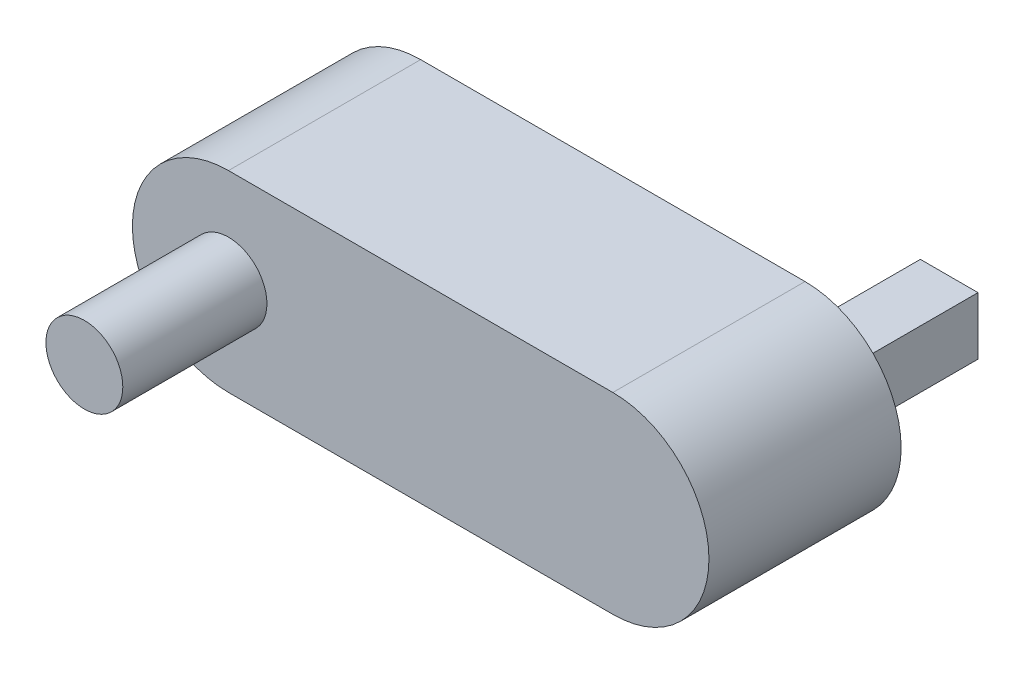
ISO-10303-21;
HEADER;
FILE_DESCRIPTION(('STEP AP214'),'2;1');
FILE_NAME('part.step','',(''),(''),'','','');
FILE_SCHEMA(('AUTOMOTIVE_DESIGN { 1 0 10303 214 1 1 1 1 }'));
ENDSEC;
DATA;
#1=APPLICATION_CONTEXT('core data for automotive mechanical design processes');
#2=APPLICATION_PROTOCOL_DEFINITION('international standard','automotive_design',2000,#1);
#3=PRODUCT_CONTEXT('',#1,'mechanical');
#4=PRODUCT('Part','Part','',(#3));
#5=PRODUCT_RELATED_PRODUCT_CATEGORY('part','',(#4));
#6=PRODUCT_DEFINITION_FORMATION('','',#4);
#7=PRODUCT_DEFINITION_CONTEXT('part definition',#1,'design');
#8=PRODUCT_DEFINITION('design','',#6,#7);
#9=PRODUCT_DEFINITION_SHAPE('','',#8);
#10=(LENGTH_UNIT() NAMED_UNIT(*) SI_UNIT(.MILLI.,.METRE.));
#11=(NAMED_UNIT(*) PLANE_ANGLE_UNIT() SI_UNIT($,.RADIAN.));
#12=(NAMED_UNIT(*) SI_UNIT($,.STERADIAN.) SOLID_ANGLE_UNIT());
#13=UNCERTAINTY_MEASURE_WITH_UNIT(LENGTH_MEASURE(1.E-05),#10,'distance_accuracy_value','');
#14=(GEOMETRIC_REPRESENTATION_CONTEXT(3) GLOBAL_UNCERTAINTY_ASSIGNED_CONTEXT((#13)) GLOBAL_UNIT_ASSIGNED_CONTEXT((#10,
#11,#12)) REPRESENTATION_CONTEXT('',''));
#15=CARTESIAN_POINT('',(0.,0.,0.));
#16=DIRECTION('',(0.,0.,1.));
#17=DIRECTION('',(1.,0.,0.));
#18=AXIS2_PLACEMENT_3D('',#15,#16,#17);
#19=CARTESIAN_POINT('',(0.,0.,-10.));
#20=DIRECTION('',(0.,0.,1.));
#21=DIRECTION('',(1.,0.,0.));
#22=AXIS2_PLACEMENT_3D('',#19,#20,#21);
#23=PLANE('',#22);
#24=CARTESIAN_POINT('',(0.,0.,-10.));
#25=DIRECTION('',(0.,0.,1.));
#26=DIRECTION('',(1.,0.,0.));
#27=AXIS2_PLACEMENT_3D('',#24,#25,#26);
#28=CIRCLE('',#27,10.);
#29=CARTESIAN_POINT('',(0.,10.,-10.));
#30=VERTEX_POINT('',#29);
#31=CARTESIAN_POINT('',(0.,-10.,-10.));
#32=VERTEX_POINT('',#31);
#33=EDGE_CURVE('E137',#30,#32,#28,.T.);
#34=ORIENTED_EDGE('',*,*,#33,.F.);
#35=DIRECTION('',(-1.,0.,0.));
#36=VECTOR('',#35,1.);
#37=CARTESIAN_POINT('',(0.,10.,-10.));
#38=LINE('',#37,#36);
#39=CARTESIAN_POINT('',(40.,10.,-10.));
#40=VERTEX_POINT('',#39);
#41=EDGE_CURVE('E143',#40,#30,#38,.T.);
#42=ORIENTED_EDGE('',*,*,#41,.F.);
#43=CARTESIAN_POINT('',(40.,0.,-10.));
#44=DIRECTION('',(0.,0.,1.));
#45=DIRECTION('',(1.,0.,0.));
#46=AXIS2_PLACEMENT_3D('',#43,#44,#45);
#47=CIRCLE('',#46,10.);
#48=CARTESIAN_POINT('',(40.,-10.,-10.));
#49=VERTEX_POINT('',#48);
#50=EDGE_CURVE('E154',#49,#40,#47,.T.);
#51=ORIENTED_EDGE('',*,*,#50,.F.);
#52=DIRECTION('',(1.,0.,0.));
#53=VECTOR('',#52,1.);
#54=CARTESIAN_POINT('',(0.,-10.,-10.));
#55=LINE('',#54,#53);
#56=EDGE_CURVE('E152',#32,#49,#55,.T.);
#57=ORIENTED_EDGE('',*,*,#56,.F.);
#58=EDGE_LOOP('',(#34,#42,#51,#57));
#59=FACE_BOUND('',#58,.T.);
#60=DIRECTION('',(0.,1.,0.));
#61=VECTOR('',#60,1.);
#62=CARTESIAN_POINT('',(37.,-3.,-10.));
#63=LINE('',#62,#61);
#64=CARTESIAN_POINT('',(37.,-3.,-10.));
#65=VERTEX_POINT('',#64);
#66=CARTESIAN_POINT('',(37.,3.,-10.));
#67=VERTEX_POINT('',#66);
#68=EDGE_CURVE('E126',#65,#67,#63,.T.);
#69=ORIENTED_EDGE('',*,*,#68,.F.);
#70=DIRECTION('',(-1.,0.,0.));
#71=VECTOR('',#70,1.);
#72=CARTESIAN_POINT('',(43.,-3.,-10.));
#73=LINE('',#72,#71);
#74=CARTESIAN_POINT('',(43.,-3.,-10.));
#75=VERTEX_POINT('',#74);
#76=EDGE_CURVE('E123',#75,#65,#73,.T.);
#77=ORIENTED_EDGE('',*,*,#76,.F.);
#78=DIRECTION('',(0.,-1.,0.));
#79=VECTOR('',#78,1.);
#80=CARTESIAN_POINT('',(43.,-3.,-10.));
#81=LINE('',#80,#79);
#82=CARTESIAN_POINT('',(43.,3.,-10.));
#83=VERTEX_POINT('',#82);
#84=EDGE_CURVE('E61',#83,#75,#81,.T.);
#85=ORIENTED_EDGE('',*,*,#84,.F.);
#86=DIRECTION('',(1.,0.,0.));
#87=VECTOR('',#86,1.);
#88=CARTESIAN_POINT('',(43.,3.,-10.));
#89=LINE('',#88,#87);
#90=EDGE_CURVE('E56',#67,#83,#89,.T.);
#91=ORIENTED_EDGE('',*,*,#90,.F.);
#92=EDGE_LOOP('',(#69,#77,#85,#91));
#93=FACE_BOUND('',#92,.T.);
#94=ADVANCED_FACE('F41',(#59,#93),#23,.F.);
#95=CARTESIAN_POINT('',(0.,0.,10.));
#96=DIRECTION('',(0.,0.,-1.));
#97=DIRECTION('',(-1.,0.,0.));
#98=AXIS2_PLACEMENT_3D('',#95,#96,#97);
#99=CYLINDRICAL_SURFACE('',#98,10.);
#100=ORIENTED_EDGE('',*,*,#33,.T.);
#101=DIRECTION('',(0.,0.,-1.));
#102=VECTOR('',#101,1.);
#103=CARTESIAN_POINT('',(0.,-10.,10.));
#104=LINE('',#103,#102);
#105=CARTESIAN_POINT('',(0.,-10.,10.));
#106=VERTEX_POINT('',#105);
#107=EDGE_CURVE('E11',#106,#32,#104,.T.);
#108=ORIENTED_EDGE('',*,*,#107,.F.);
#109=CARTESIAN_POINT('',(0.,0.,10.));
#110=DIRECTION('',(0.,0.,1.));
#111=DIRECTION('',(1.,0.,0.));
#112=AXIS2_PLACEMENT_3D('',#109,#110,#111);
#113=CIRCLE('',#112,10.);
#114=CARTESIAN_POINT('',(0.,10.,10.));
#115=VERTEX_POINT('',#114);
#116=EDGE_CURVE('E139',#115,#106,#113,.T.);
#117=ORIENTED_EDGE('',*,*,#116,.F.);
#118=DIRECTION('',(0.,0.,-1.));
#119=VECTOR('',#118,1.);
#120=CARTESIAN_POINT('',(0.,10.,10.));
#121=LINE('',#120,#119);
#122=EDGE_CURVE('E149',#115,#30,#121,.T.);
#123=ORIENTED_EDGE('',*,*,#122,.T.);
#124=EDGE_LOOP('',(#100,#108,#117,#123));
#125=FACE_BOUND('',#124,.T.);
#126=ADVANCED_FACE('F43',(#125),#99,.T.);
#127=CARTESIAN_POINT('',(0.,-10.,10.));
#128=DIRECTION('',(0.,1.,0.));
#129=DIRECTION('',(0.,0.,1.));
#130=AXIS2_PLACEMENT_3D('',#127,#128,#129);
#131=PLANE('',#130);
#132=ORIENTED_EDGE('',*,*,#56,.T.);
#133=DIRECTION('',(0.,0.,-1.));
#134=VECTOR('',#133,1.);
#135=CARTESIAN_POINT('',(40.,-10.,10.));
#136=LINE('',#135,#134);
#137=CARTESIAN_POINT('',(40.,-10.,10.));
#138=VERTEX_POINT('',#137);
#139=EDGE_CURVE('E49',#138,#49,#136,.T.);
#140=ORIENTED_EDGE('',*,*,#139,.F.);
#141=DIRECTION('',(1.,0.,0.));
#142=VECTOR('',#141,1.);
#143=CARTESIAN_POINT('',(0.,-10.,10.));
#144=LINE('',#143,#142);
#145=EDGE_CURVE('E142',#106,#138,#144,.T.);
#146=ORIENTED_EDGE('',*,*,#145,.F.);
#147=ORIENTED_EDGE('',*,*,#107,.T.);
#148=EDGE_LOOP('',(#132,#140,#146,#147));
#149=FACE_BOUND('',#148,.T.);
#150=ADVANCED_FACE('F181',(#149),#131,.F.);
#151=CARTESIAN_POINT('',(40.,0.,10.));
#152=DIRECTION('',(0.,0.,-1.));
#153=DIRECTION('',(-1.,0.,0.));
#154=AXIS2_PLACEMENT_3D('',#151,#152,#153);
#155=CYLINDRICAL_SURFACE('',#154,10.);
#156=ORIENTED_EDGE('',*,*,#50,.T.);
#157=DIRECTION('',(0.,0.,-1.));
#158=VECTOR('',#157,1.);
#159=CARTESIAN_POINT('',(40.,10.,10.));
#160=LINE('',#159,#158);
#161=CARTESIAN_POINT('',(40.,10.,10.));
#162=VERTEX_POINT('',#161);
#163=EDGE_CURVE('E159',#162,#40,#160,.T.);
#164=ORIENTED_EDGE('',*,*,#163,.F.);
#165=CARTESIAN_POINT('',(40.,0.,10.));
#166=DIRECTION('',(0.,0.,1.));
#167=DIRECTION('',(1.,0.,0.));
#168=AXIS2_PLACEMENT_3D('',#165,#166,#167);
#169=CIRCLE('',#168,10.);
#170=EDGE_CURVE('E145',#138,#162,#169,.T.);
#171=ORIENTED_EDGE('',*,*,#170,.F.);
#172=ORIENTED_EDGE('',*,*,#139,.T.);
#173=EDGE_LOOP('',(#156,#164,#171,#172));
#174=FACE_BOUND('',#173,.T.);
#175=ADVANCED_FACE('F166',(#174),#155,.T.);
#176=CARTESIAN_POINT('',(0.,10.,10.));
#177=DIRECTION('',(0.,-1.,0.));
#178=DIRECTION('',(0.,0.,-1.));
#179=AXIS2_PLACEMENT_3D('',#176,#177,#178);
#180=PLANE('',#179);
#181=ORIENTED_EDGE('',*,*,#41,.T.);
#182=ORIENTED_EDGE('',*,*,#122,.F.);
#183=DIRECTION('',(-1.,0.,0.));
#184=VECTOR('',#183,1.);
#185=CARTESIAN_POINT('',(0.,10.,10.));
#186=LINE('',#185,#184);
#187=EDGE_CURVE('E147',#162,#115,#186,.T.);
#188=ORIENTED_EDGE('',*,*,#187,.F.);
#189=ORIENTED_EDGE('',*,*,#163,.T.);
#190=EDGE_LOOP('',(#181,#182,#188,#189));
#191=FACE_BOUND('',#190,.T.);
#192=ADVANCED_FACE('F174',(#191),#180,.F.);
#193=CARTESIAN_POINT('',(0.,0.,10.));
#194=DIRECTION('',(0.,0.,1.));
#195=DIRECTION('',(1.,0.,0.));
#196=AXIS2_PLACEMENT_3D('',#193,#194,#195);
#197=PLANE('',#196);
#198=CARTESIAN_POINT('',(0.,0.,10.));
#199=DIRECTION('',(0.,0.,1.));
#200=DIRECTION('',(1.,0.,0.));
#201=AXIS2_PLACEMENT_3D('',#198,#199,#200);
#202=CIRCLE('',#201,4.);
#203=CARTESIAN_POINT('',(4.,0.,10.));
#204=VERTEX_POINT('',#203);
#205=EDGE_CURVE('E127',#204,#204,#202,.T.);
#206=ORIENTED_EDGE('',*,*,#205,.F.);
#207=EDGE_LOOP('',(#206));
#208=FACE_BOUND('',#207,.T.);
#209=ORIENTED_EDGE('',*,*,#116,.T.);
#210=ORIENTED_EDGE('',*,*,#145,.T.);
#211=ORIENTED_EDGE('',*,*,#170,.T.);
#212=ORIENTED_EDGE('',*,*,#187,.T.);
#213=EDGE_LOOP('',(#209,#210,#211,#212));
#214=FACE_BOUND('',#213,.T.);
#215=ADVANCED_FACE('F180',(#208,#214),#197,.T.);
#216=CARTESIAN_POINT('',(0.,0.,25.));
#217=DIRECTION('',(0.,0.,-1.));
#218=DIRECTION('',(-1.,0.,0.));
#219=AXIS2_PLACEMENT_3D('',#216,#217,#218);
#220=CYLINDRICAL_SURFACE('',#219,4.);
#221=CARTESIAN_POINT('',(0.,0.,25.));
#222=DIRECTION('',(0.,0.,1.));
#223=DIRECTION('',(1.,0.,0.));
#224=AXIS2_PLACEMENT_3D('',#221,#222,#223);
#225=CIRCLE('',#224,4.);
#226=CARTESIAN_POINT('',(4.,0.,25.));
#227=VERTEX_POINT('',#226);
#228=EDGE_CURVE('E130',#227,#227,#225,.T.);
#229=ORIENTED_EDGE('',*,*,#228,.F.);
#230=EDGE_LOOP('',(#229));
#231=FACE_BOUND('',#230,.T.);
#232=ORIENTED_EDGE('',*,*,#205,.T.);
#233=EDGE_LOOP('',(#232));
#234=FACE_BOUND('',#233,.T.);
#235=ADVANCED_FACE('F201',(#231,#234),#220,.T.);
#236=CARTESIAN_POINT('',(0.,0.,25.));
#237=DIRECTION('',(0.,0.,1.));
#238=DIRECTION('',(1.,0.,0.));
#239=AXIS2_PLACEMENT_3D('',#236,#237,#238);
#240=PLANE('',#239);
#241=ORIENTED_EDGE('',*,*,#228,.T.);
#242=EDGE_LOOP('',(#241));
#243=FACE_BOUND('',#242,.T.);
#244=ADVANCED_FACE('F206',(#243),#240,.T.);
#245=CARTESIAN_POINT('',(37.,-3.,-25.));
#246=DIRECTION('',(1.,0.,0.));
#247=DIRECTION('',(0.,0.,-1.));
#248=AXIS2_PLACEMENT_3D('',#245,#246,#247);
#249=PLANE('',#248);
#250=ORIENTED_EDGE('',*,*,#68,.T.);
#251=DIRECTION('',(0.,0.,1.));
#252=VECTOR('',#251,1.);
#253=CARTESIAN_POINT('',(37.,3.,-25.));
#254=LINE('',#253,#252);
#255=CARTESIAN_POINT('',(37.,3.,-25.));
#256=VERTEX_POINT('',#255);
#257=EDGE_CURVE('E107',#256,#67,#254,.T.);
#258=ORIENTED_EDGE('',*,*,#257,.F.);
#259=DIRECTION('',(0.,1.,0.));
#260=VECTOR('',#259,1.);
#261=CARTESIAN_POINT('',(37.,-3.,-25.));
#262=LINE('',#261,#260);
#263=CARTESIAN_POINT('',(37.,-3.,-25.));
#264=VERTEX_POINT('',#263);
#265=EDGE_CURVE('E114',#264,#256,#262,.T.);
#266=ORIENTED_EDGE('',*,*,#265,.F.);
#267=DIRECTION('',(0.,0.,1.));
#268=VECTOR('',#267,1.);
#269=CARTESIAN_POINT('',(37.,-3.,-25.));
#270=LINE('',#269,#268);
#271=EDGE_CURVE('E298',#264,#65,#270,.T.);
#272=ORIENTED_EDGE('',*,*,#271,.T.);
#273=EDGE_LOOP('',(#250,#258,#266,#272));
#274=FACE_BOUND('',#273,.T.);
#275=ADVANCED_FACE('F125',(#274),#249,.F.);
#276=CARTESIAN_POINT('',(43.,3.,-25.));
#277=DIRECTION('',(0.,-1.,0.));
#278=DIRECTION('',(0.,0.,-1.));
#279=AXIS2_PLACEMENT_3D('',#276,#277,#278);
#280=PLANE('',#279);
#281=ORIENTED_EDGE('',*,*,#90,.T.);
#282=DIRECTION('',(0.,0.,1.));
#283=VECTOR('',#282,1.);
#284=CARTESIAN_POINT('',(43.,3.,-25.));
#285=LINE('',#284,#283);
#286=CARTESIAN_POINT('',(43.,3.,-25.));
#287=VERTEX_POINT('',#286);
#288=EDGE_CURVE('E110',#287,#83,#285,.T.);
#289=ORIENTED_EDGE('',*,*,#288,.F.);
#290=DIRECTION('',(1.,0.,0.));
#291=VECTOR('',#290,1.);
#292=CARTESIAN_POINT('',(43.,3.,-25.));
#293=LINE('',#292,#291);
#294=EDGE_CURVE('E103',#256,#287,#293,.T.);
#295=ORIENTED_EDGE('',*,*,#294,.F.);
#296=ORIENTED_EDGE('',*,*,#257,.T.);
#297=EDGE_LOOP('',(#281,#289,#295,#296));
#298=FACE_BOUND('',#297,.T.);
#299=ADVANCED_FACE('F105',(#298),#280,.F.);
#300=CARTESIAN_POINT('',(43.,-3.,-25.));
#301=DIRECTION('',(-1.,0.,0.));
#302=DIRECTION('',(0.,0.,1.));
#303=AXIS2_PLACEMENT_3D('',#300,#301,#302);
#304=PLANE('',#303);
#305=ORIENTED_EDGE('',*,*,#84,.T.);
#306=DIRECTION('',(0.,0.,1.));
#307=VECTOR('',#306,1.);
#308=CARTESIAN_POINT('',(43.,-3.,-25.));
#309=LINE('',#308,#307);
#310=CARTESIAN_POINT('',(43.,-3.,-25.));
#311=VERTEX_POINT('',#310);
#312=EDGE_CURVE('E132',#311,#75,#309,.T.);
#313=ORIENTED_EDGE('',*,*,#312,.F.);
#314=DIRECTION('',(0.,-1.,0.));
#315=VECTOR('',#314,1.);
#316=CARTESIAN_POINT('',(43.,-3.,-25.));
#317=LINE('',#316,#315);
#318=EDGE_CURVE('E113',#287,#311,#317,.T.);
#319=ORIENTED_EDGE('',*,*,#318,.F.);
#320=ORIENTED_EDGE('',*,*,#288,.T.);
#321=EDGE_LOOP('',(#305,#313,#319,#320));
#322=FACE_BOUND('',#321,.T.);
#323=ADVANCED_FACE('F219',(#322),#304,.F.);
#324=CARTESIAN_POINT('',(43.,-3.,-25.));
#325=DIRECTION('',(0.,1.,0.));
#326=DIRECTION('',(0.,0.,1.));
#327=AXIS2_PLACEMENT_3D('',#324,#325,#326);
#328=PLANE('',#327);
#329=ORIENTED_EDGE('',*,*,#76,.T.);
#330=ORIENTED_EDGE('',*,*,#271,.F.);
#331=DIRECTION('',(-1.,0.,0.));
#332=VECTOR('',#331,1.);
#333=CARTESIAN_POINT('',(43.,-3.,-25.));
#334=LINE('',#333,#332);
#335=EDGE_CURVE('E119',#311,#264,#334,.T.);
#336=ORIENTED_EDGE('',*,*,#335,.F.);
#337=ORIENTED_EDGE('',*,*,#312,.T.);
#338=EDGE_LOOP('',(#329,#330,#336,#337));
#339=FACE_BOUND('',#338,.T.);
#340=ADVANCED_FACE('F222',(#339),#328,.F.);
#341=CARTESIAN_POINT('',(0.,0.,-25.));
#342=DIRECTION('',(0.,0.,1.));
#343=DIRECTION('',(1.,0.,0.));
#344=AXIS2_PLACEMENT_3D('',#341,#342,#343);
#345=PLANE('',#344);
#346=ORIENTED_EDGE('',*,*,#265,.T.);
#347=ORIENTED_EDGE('',*,*,#294,.T.);
#348=ORIENTED_EDGE('',*,*,#318,.T.);
#349=ORIENTED_EDGE('',*,*,#335,.T.);
#350=EDGE_LOOP('',(#346,#347,#348,#349));
#351=FACE_BOUND('',#350,.T.);
#352=ADVANCED_FACE('F117',(#351),#345,.F.);
#353=CLOSED_SHELL('',(#94,#126,#150,#175,#192,#215,#235,#244,#275,#299,#323,#340,#352));
#354=MANIFOLD_SOLID_BREP('B2',#353);
#355=ADVANCED_BREP_SHAPE_REPRESENTATION('',(#18,#354),#14);
#356=SHAPE_DEFINITION_REPRESENTATION(#9,#355);
ENDSEC;
END-ISO-10303-21;
